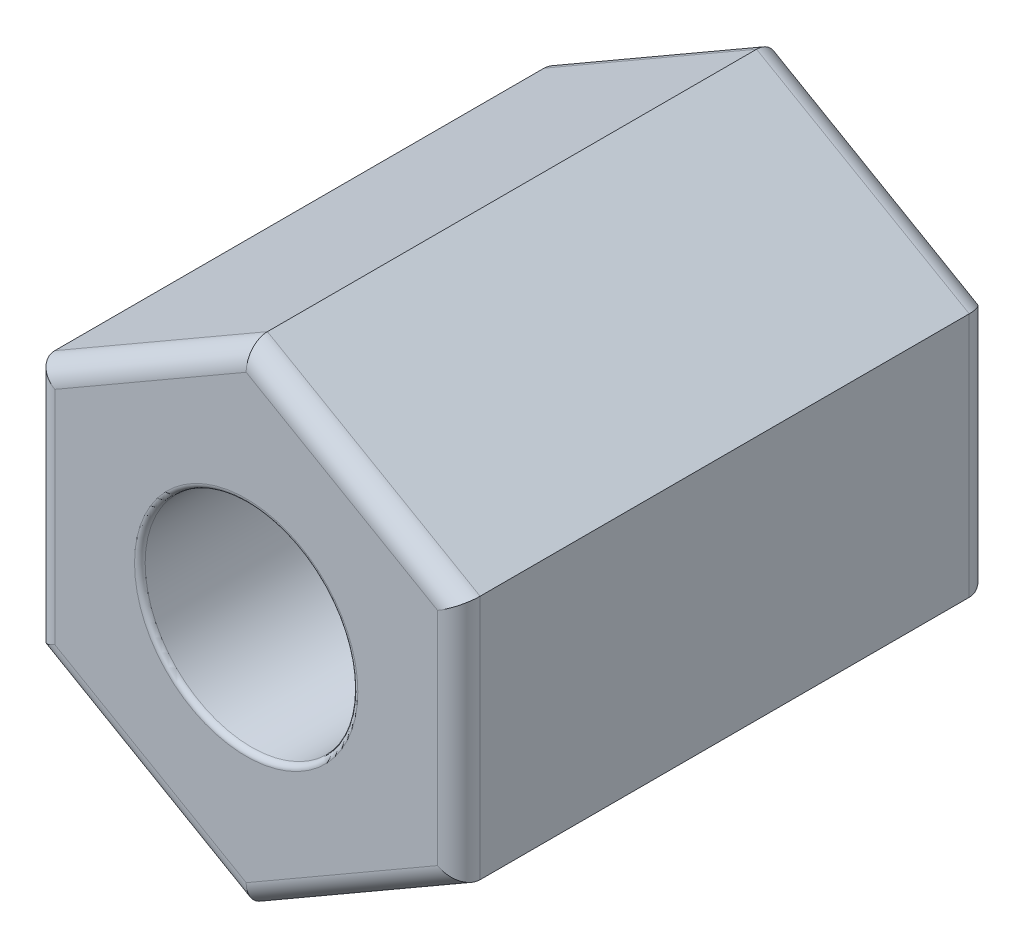
ISO-10303-21;
HEADER;
FILE_DESCRIPTION(('STEP AP214'),'2;1');
FILE_NAME('part.step','',(''),(''),'','','');
FILE_SCHEMA(('AUTOMOTIVE_DESIGN { 1 0 10303 214 1 1 1 1 }'));
ENDSEC;
DATA;
#1=APPLICATION_CONTEXT('core data for automotive mechanical design processes');
#2=APPLICATION_PROTOCOL_DEFINITION('international standard','automotive_design',2000,#1);
#3=PRODUCT_CONTEXT('',#1,'mechanical');
#4=PRODUCT('Part','Part','',(#3));
#5=PRODUCT_RELATED_PRODUCT_CATEGORY('part','',(#4));
#6=PRODUCT_DEFINITION_FORMATION('','',#4);
#7=PRODUCT_DEFINITION_CONTEXT('part definition',#1,'design');
#8=PRODUCT_DEFINITION('design','',#6,#7);
#9=PRODUCT_DEFINITION_SHAPE('','',#8);
#10=(LENGTH_UNIT() NAMED_UNIT(*) SI_UNIT(.MILLI.,.METRE.));
#11=(NAMED_UNIT(*) PLANE_ANGLE_UNIT() SI_UNIT($,.RADIAN.));
#12=(NAMED_UNIT(*) SI_UNIT($,.STERADIAN.) SOLID_ANGLE_UNIT());
#13=UNCERTAINTY_MEASURE_WITH_UNIT(LENGTH_MEASURE(1.E-05),#10,'distance_accuracy_value','');
#14=(GEOMETRIC_REPRESENTATION_CONTEXT(3) GLOBAL_UNCERTAINTY_ASSIGNED_CONTEXT((#13)) GLOBAL_UNIT_ASSIGNED_CONTEXT((#10,
#11,#12)) REPRESENTATION_CONTEXT('',''));
#15=CARTESIAN_POINT('',(0.,0.,0.));
#16=DIRECTION('',(0.,0.,1.));
#17=DIRECTION('',(1.,0.,0.));
#18=AXIS2_PLACEMENT_3D('',#15,#16,#17);
#19=CARTESIAN_POINT('',(0.,0.,50.));
#20=DIRECTION('',(0.,0.,1.));
#21=DIRECTION('',(1.,0.,0.));
#22=AXIS2_PLACEMENT_3D('',#19,#20,#21);
#23=PLANE('',#22);
#24=CARTESIAN_POINT('',(0.,0.,50.));
#25=DIRECTION('',(0.,0.,1.));
#26=DIRECTION('',(1.,0.,0.));
#27=AXIS2_PLACEMENT_3D('',#24,#25,#26);
#28=CIRCLE('',#27,10.5);
#29=CARTESIAN_POINT('',(10.5,0.,50.));
#30=VERTEX_POINT('',#29);
#31=EDGE_CURVE('E11',#30,#30,#28,.F.);
#32=ORIENTED_EDGE('',*,*,#31,.T.);
#33=EDGE_LOOP('',(#32));
#34=FACE_BOUND('',#33,.T.);
#35=DIRECTION('',(0.866025403784439,0.5,0.));
#36=VECTOR('',#35,1.);
#37=CARTESIAN_POINT('',(19.,-9.81495457622363,50.));
#38=LINE('',#37,#36);
#39=CARTESIAN_POINT('',(0.,-20.7846096908265,50.));
#40=VERTEX_POINT('',#39);
#41=CARTESIAN_POINT('',(18.,-10.3923048454133,50.));
#42=VERTEX_POINT('',#41);
#43=EDGE_CURVE('E49',#40,#42,#38,.T.);
#44=ORIENTED_EDGE('',*,*,#43,.T.);
#45=DIRECTION('',(0.,1.,0.));
#46=VECTOR('',#45,1.);
#47=CARTESIAN_POINT('',(18.,11.5470053837925,50.));
#48=LINE('',#47,#46);
#49=CARTESIAN_POINT('',(18.,10.3923048454133,50.));
#50=VERTEX_POINT('',#49);
#51=EDGE_CURVE('E129',#42,#50,#48,.T.);
#52=ORIENTED_EDGE('',*,*,#51,.T.);
#53=DIRECTION('',(-0.866025403784438,0.5,0.));
#54=VECTOR('',#53,1.);
#55=CARTESIAN_POINT('',(-0.999999999999987,21.3619599600162,50.));
#56=LINE('',#55,#54);
#57=CARTESIAN_POINT('',(0.,20.7846096908265,50.));
#58=VERTEX_POINT('',#57);
#59=EDGE_CURVE('E194',#50,#58,#56,.T.);
#60=ORIENTED_EDGE('',*,*,#59,.T.);
#61=DIRECTION('',(-0.866025403784439,-0.5,0.));
#62=VECTOR('',#61,1.);
#63=CARTESIAN_POINT('',(-19.,9.81495457622363,50.));
#64=LINE('',#63,#62);
#65=CARTESIAN_POINT('',(-18.,10.3923048454133,50.));
#66=VERTEX_POINT('',#65);
#67=EDGE_CURVE('E196',#58,#66,#64,.T.);
#68=ORIENTED_EDGE('',*,*,#67,.T.);
#69=DIRECTION('',(0.,-1.,0.));
#70=VECTOR('',#69,1.);
#71=CARTESIAN_POINT('',(-18.,-11.5470053837925,50.));
#72=LINE('',#71,#70);
#73=CARTESIAN_POINT('',(-18.,-10.3923048454133,50.));
#74=VERTEX_POINT('',#73);
#75=EDGE_CURVE('E198',#66,#74,#72,.T.);
#76=ORIENTED_EDGE('',*,*,#75,.T.);
#77=DIRECTION('',(0.866025403784439,-0.5,0.));
#78=VECTOR('',#77,1.);
#79=CARTESIAN_POINT('',(0.999999999999984,-21.3619599600162,50.));
#80=LINE('',#79,#78);
#81=EDGE_CURVE('E54',#74,#40,#80,.T.);
#82=ORIENTED_EDGE('',*,*,#81,.T.);
#83=EDGE_LOOP('',(#44,#52,#60,#68,#76,#82));
#84=FACE_BOUND('',#83,.T.);
#85=ADVANCED_FACE('F34',(#34,#84),#23,.T.);
#86=CARTESIAN_POINT('',(0.,0.,0.));
#87=DIRECTION('',(0.,0.,1.));
#88=DIRECTION('',(1.,0.,0.));
#89=AXIS2_PLACEMENT_3D('',#86,#87,#88);
#90=PLANE('',#89);
#91=CARTESIAN_POINT('',(0.,0.,0.));
#92=DIRECTION('',(0.,0.,1.));
#93=DIRECTION('',(1.,0.,0.));
#94=AXIS2_PLACEMENT_3D('',#91,#92,#93);
#95=CIRCLE('',#94,10.5);
#96=CARTESIAN_POINT('',(10.5,0.,0.));
#97=VERTEX_POINT('',#96);
#98=EDGE_CURVE('E203',#97,#97,#95,.T.);
#99=ORIENTED_EDGE('',*,*,#98,.T.);
#100=EDGE_LOOP('',(#99));
#101=FACE_BOUND('',#100,.T.);
#102=DIRECTION('',(0.,1.,0.));
#103=VECTOR('',#102,1.);
#104=CARTESIAN_POINT('',(18.,0.,0.));
#105=LINE('',#104,#103);
#106=CARTESIAN_POINT('',(18.,10.3923048454133,0.));
#107=VERTEX_POINT('',#106);
#108=CARTESIAN_POINT('',(18.,-10.3923048454133,0.));
#109=VERTEX_POINT('',#108);
#110=EDGE_CURVE('E165',#107,#109,#105,.F.);
#111=ORIENTED_EDGE('',*,*,#110,.T.);
#112=DIRECTION('',(0.866025403784439,0.5,0.));
#113=VECTOR('',#112,1.);
#114=CARTESIAN_POINT('',(9.00000000000001,-15.5884572681199,0.));
#115=LINE('',#114,#113);
#116=CARTESIAN_POINT('',(0.,-20.7846096908265,0.));
#117=VERTEX_POINT('',#116);
#118=EDGE_CURVE('E175',#109,#117,#115,.F.);
#119=ORIENTED_EDGE('',*,*,#118,.T.);
#120=DIRECTION('',(0.866025403784439,-0.5,0.));
#121=VECTOR('',#120,1.);
#122=CARTESIAN_POINT('',(-9.00000000000001,-15.5884572681199,0.));
#123=LINE('',#122,#121);
#124=CARTESIAN_POINT('',(-18.,-10.3923048454133,0.));
#125=VERTEX_POINT('',#124);
#126=EDGE_CURVE('E173',#117,#125,#123,.F.);
#127=ORIENTED_EDGE('',*,*,#126,.T.);
#128=DIRECTION('',(0.,-1.,0.));
#129=VECTOR('',#128,1.);
#130=CARTESIAN_POINT('',(-18.,0.,0.));
#131=LINE('',#130,#129);
#132=CARTESIAN_POINT('',(-18.,10.3923048454133,0.));
#133=VERTEX_POINT('',#132);
#134=EDGE_CURVE('E171',#125,#133,#131,.F.);
#135=ORIENTED_EDGE('',*,*,#134,.T.);
#136=DIRECTION('',(-0.866025403784439,-0.5,0.));
#137=VECTOR('',#136,1.);
#138=CARTESIAN_POINT('',(-9.00000000000001,15.5884572681199,0.));
#139=LINE('',#138,#137);
#140=CARTESIAN_POINT('',(0.,20.7846096908265,0.));
#141=VERTEX_POINT('',#140);
#142=EDGE_CURVE('E169',#133,#141,#139,.F.);
#143=ORIENTED_EDGE('',*,*,#142,.T.);
#144=DIRECTION('',(-0.866025403784438,0.5,0.));
#145=VECTOR('',#144,1.);
#146=CARTESIAN_POINT('',(9.00000000000001,15.5884572681199,0.));
#147=LINE('',#146,#145);
#148=EDGE_CURVE('E167',#141,#107,#147,.F.);
#149=ORIENTED_EDGE('',*,*,#148,.T.);
#150=EDGE_LOOP('',(#111,#119,#127,#135,#143,#149));
#151=FACE_BOUND('',#150,.T.);
#152=ADVANCED_FACE('F246',(#101,#151),#90,.F.);
#153=CARTESIAN_POINT('',(-20.,-11.5470053837925,50.));
#154=DIRECTION('',(0.5,0.866025403784439,0.));
#155=DIRECTION('',(-0.866025403784439,0.5,0.));
#156=AXIS2_PLACEMENT_3D('',#153,#154,#155);
#157=PLANE('',#156);
#158=DIRECTION('',(0.,0.,-1.));
#159=VECTOR('',#158,1.);
#160=CARTESIAN_POINT('',(-20.,-11.5470053837925,50.));
#161=LINE('',#160,#159);
#162=CARTESIAN_POINT('',(-20.,-11.5470053837925,48.));
#163=VERTEX_POINT('',#162);
#164=CARTESIAN_POINT('',(-20.,-11.5470053837925,2.));
#165=VERTEX_POINT('',#164);
#166=EDGE_CURVE('E221',#163,#165,#161,.T.);
#167=ORIENTED_EDGE('',*,*,#166,.T.);
#168=DIRECTION('',(0.866025403784439,-0.5,0.));
#169=VECTOR('',#168,1.);
#170=CARTESIAN_POINT('',(-20.,-11.5470053837925,2.));
#171=LINE('',#170,#169);
#172=CARTESIAN_POINT('',(0.,-23.094010767585,2.));
#173=VERTEX_POINT('',#172);
#174=EDGE_CURVE('E180',#165,#173,#171,.T.);
#175=ORIENTED_EDGE('',*,*,#174,.T.);
#176=DIRECTION('',(0.,0.,-1.));
#177=VECTOR('',#176,1.);
#178=CARTESIAN_POINT('',(0.,-23.094010767585,50.));
#179=LINE('',#178,#177);
#180=CARTESIAN_POINT('',(0.,-23.094010767585,48.));
#181=VERTEX_POINT('',#180);
#182=EDGE_CURVE('E143',#181,#173,#179,.T.);
#183=ORIENTED_EDGE('',*,*,#182,.F.);
#184=DIRECTION('',(0.866025403784439,-0.5,0.));
#185=VECTOR('',#184,1.);
#186=CARTESIAN_POINT('',(-20.,-11.5470053837925,48.));
#187=LINE('',#186,#185);
#188=EDGE_CURVE('E178',#181,#163,#187,.F.);
#189=ORIENTED_EDGE('',*,*,#188,.T.);
#190=EDGE_LOOP('',(#167,#175,#183,#189));
#191=FACE_BOUND('',#190,.T.);
#192=ADVANCED_FACE('F249',(#191),#157,.F.);
#193=CARTESIAN_POINT('',(0.,-23.094010767585,50.));
#194=DIRECTION('',(-0.5,0.866025403784438,0.));
#195=DIRECTION('',(-0.866025403784439,-0.5,0.));
#196=AXIS2_PLACEMENT_3D('',#193,#194,#195);
#197=PLANE('',#196);
#198=ORIENTED_EDGE('',*,*,#182,.T.);
#199=DIRECTION('',(0.866025403784439,0.5,0.));
#200=VECTOR('',#199,1.);
#201=CARTESIAN_POINT('',(0.,-23.094010767585,2.));
#202=LINE('',#201,#200);
#203=CARTESIAN_POINT('',(20.,-11.5470053837925,2.));
#204=VERTEX_POINT('',#203);
#205=EDGE_CURVE('E142',#173,#204,#202,.T.);
#206=ORIENTED_EDGE('',*,*,#205,.T.);
#207=DIRECTION('',(0.,0.,-1.));
#208=VECTOR('',#207,1.);
#209=CARTESIAN_POINT('',(20.,-11.5470053837925,50.));
#210=LINE('',#209,#208);
#211=CARTESIAN_POINT('',(20.,-11.5470053837925,48.));
#212=VERTEX_POINT('',#211);
#213=EDGE_CURVE('E149',#212,#204,#210,.T.);
#214=ORIENTED_EDGE('',*,*,#213,.F.);
#215=DIRECTION('',(0.866025403784439,0.5,0.));
#216=VECTOR('',#215,1.);
#217=CARTESIAN_POINT('',(0.,-23.094010767585,48.));
#218=LINE('',#217,#216);
#219=EDGE_CURVE('E135',#212,#181,#218,.F.);
#220=ORIENTED_EDGE('',*,*,#219,.T.);
#221=EDGE_LOOP('',(#198,#206,#214,#220));
#222=FACE_BOUND('',#221,.T.);
#223=ADVANCED_FACE('F156',(#222),#197,.F.);
#224=CARTESIAN_POINT('',(20.,-11.5470053837925,50.));
#225=DIRECTION('',(-1.,0.,0.));
#226=DIRECTION('',(0.,-1.,0.));
#227=AXIS2_PLACEMENT_3D('',#224,#225,#226);
#228=PLANE('',#227);
#229=ORIENTED_EDGE('',*,*,#213,.T.);
#230=DIRECTION('',(0.,1.,0.));
#231=VECTOR('',#230,1.);
#232=CARTESIAN_POINT('',(20.,-11.5470053837925,2.));
#233=LINE('',#232,#231);
#234=CARTESIAN_POINT('',(20.,11.5470053837925,2.));
#235=VERTEX_POINT('',#234);
#236=EDGE_CURVE('E152',#204,#235,#233,.T.);
#237=ORIENTED_EDGE('',*,*,#236,.T.);
#238=DIRECTION('',(0.,0.,-1.));
#239=VECTOR('',#238,1.);
#240=CARTESIAN_POINT('',(20.,11.5470053837925,50.));
#241=LINE('',#240,#239);
#242=CARTESIAN_POINT('',(20.,11.5470053837925,48.));
#243=VERTEX_POINT('',#242);
#244=EDGE_CURVE('E151',#243,#235,#241,.T.);
#245=ORIENTED_EDGE('',*,*,#244,.F.);
#246=DIRECTION('',(0.,1.,0.));
#247=VECTOR('',#246,1.);
#248=CARTESIAN_POINT('',(20.,-11.5470053837925,48.));
#249=LINE('',#248,#247);
#250=EDGE_CURVE('E127',#243,#212,#249,.F.);
#251=ORIENTED_EDGE('',*,*,#250,.T.);
#252=EDGE_LOOP('',(#229,#237,#245,#251));
#253=FACE_BOUND('',#252,.T.);
#254=ADVANCED_FACE('F148',(#253),#228,.F.);
#255=CARTESIAN_POINT('',(20.,11.5470053837925,50.));
#256=DIRECTION('',(-0.5,-0.866025403784438,0.));
#257=DIRECTION('',(0.866025403784438,-0.5,0.));
#258=AXIS2_PLACEMENT_3D('',#255,#256,#257);
#259=PLANE('',#258);
#260=ORIENTED_EDGE('',*,*,#244,.T.);
#261=DIRECTION('',(-0.866025403784438,0.5,0.));
#262=VECTOR('',#261,1.);
#263=CARTESIAN_POINT('',(20.,11.5470053837925,2.));
#264=LINE('',#263,#262);
#265=CARTESIAN_POINT('',(0.,23.0940107675851,2.));
#266=VERTEX_POINT('',#265);
#267=EDGE_CURVE('E153',#235,#266,#264,.T.);
#268=ORIENTED_EDGE('',*,*,#267,.T.);
#269=DIRECTION('',(0.,0.,-1.));
#270=VECTOR('',#269,1.);
#271=CARTESIAN_POINT('',(0.,23.0940107675851,50.));
#272=LINE('',#271,#270);
#273=CARTESIAN_POINT('',(0.,23.0940107675851,48.));
#274=VERTEX_POINT('',#273);
#275=EDGE_CURVE('E160',#274,#266,#272,.T.);
#276=ORIENTED_EDGE('',*,*,#275,.F.);
#277=DIRECTION('',(-0.866025403784438,0.5,0.));
#278=VECTOR('',#277,1.);
#279=CARTESIAN_POINT('',(20.,11.5470053837925,48.));
#280=LINE('',#279,#278);
#281=EDGE_CURVE('E190',#274,#243,#280,.F.);
#282=ORIENTED_EDGE('',*,*,#281,.T.);
#283=EDGE_LOOP('',(#260,#268,#276,#282));
#284=FACE_BOUND('',#283,.T.);
#285=ADVANCED_FACE('F265',(#284),#259,.F.);
#286=CARTESIAN_POINT('',(0.,23.0940107675851,50.));
#287=DIRECTION('',(0.5,-0.866025403784439,0.));
#288=DIRECTION('',(0.866025403784439,0.5,0.));
#289=AXIS2_PLACEMENT_3D('',#286,#287,#288);
#290=PLANE('',#289);
#291=ORIENTED_EDGE('',*,*,#275,.T.);
#292=DIRECTION('',(-0.866025403784439,-0.5,0.));
#293=VECTOR('',#292,1.);
#294=CARTESIAN_POINT('',(0.,23.0940107675851,2.));
#295=LINE('',#294,#293);
#296=CARTESIAN_POINT('',(-20.,11.5470053837925,2.));
#297=VERTEX_POINT('',#296);
#298=EDGE_CURVE('E188',#266,#297,#295,.T.);
#299=ORIENTED_EDGE('',*,*,#298,.T.);
#300=DIRECTION('',(0.,0.,-1.));
#301=VECTOR('',#300,1.);
#302=CARTESIAN_POINT('',(-20.,11.5470053837925,50.));
#303=LINE('',#302,#301);
#304=CARTESIAN_POINT('',(-20.,11.5470053837925,48.));
#305=VERTEX_POINT('',#304);
#306=EDGE_CURVE('E282',#305,#297,#303,.T.);
#307=ORIENTED_EDGE('',*,*,#306,.F.);
#308=DIRECTION('',(-0.866025403784439,-0.5,0.));
#309=VECTOR('',#308,1.);
#310=CARTESIAN_POINT('',(0.,23.0940107675851,48.));
#311=LINE('',#310,#309);
#312=EDGE_CURVE('E186',#305,#274,#311,.F.);
#313=ORIENTED_EDGE('',*,*,#312,.T.);
#314=EDGE_LOOP('',(#291,#299,#307,#313));
#315=FACE_BOUND('',#314,.T.);
#316=ADVANCED_FACE('F281',(#315),#290,.F.);
#317=CARTESIAN_POINT('',(-20.,11.5470053837925,50.));
#318=DIRECTION('',(1.,0.,0.));
#319=DIRECTION('',(0.,0.,-1.));
#320=AXIS2_PLACEMENT_3D('',#317,#318,#319);
#321=PLANE('',#320);
#322=ORIENTED_EDGE('',*,*,#306,.T.);
#323=DIRECTION('',(0.,-1.,0.));
#324=VECTOR('',#323,1.);
#325=CARTESIAN_POINT('',(-20.,11.5470053837925,2.));
#326=LINE('',#325,#324);
#327=EDGE_CURVE('E184',#297,#165,#326,.T.);
#328=ORIENTED_EDGE('',*,*,#327,.T.);
#329=ORIENTED_EDGE('',*,*,#166,.F.);
#330=DIRECTION('',(0.,-1.,0.));
#331=VECTOR('',#330,1.);
#332=CARTESIAN_POINT('',(-20.,11.5470053837925,48.));
#333=LINE('',#332,#331);
#334=EDGE_CURVE('E182',#163,#305,#333,.F.);
#335=ORIENTED_EDGE('',*,*,#334,.T.);
#336=EDGE_LOOP('',(#322,#328,#329,#335));
#337=FACE_BOUND('',#336,.T.);
#338=ADVANCED_FACE('F285',(#337),#321,.F.);
#339=CARTESIAN_POINT('',(0.,0.,50.));
#340=DIRECTION('',(0.,0.,-1.));
#341=DIRECTION('',(-1.,0.,0.));
#342=AXIS2_PLACEMENT_3D('',#339,#340,#341);
#343=CYLINDRICAL_SURFACE('',#342,10.);
#344=CARTESIAN_POINT('',(0.,0.,0.5));
#345=DIRECTION('',(0.,0.,1.));
#346=DIRECTION('',(1.,0.,0.));
#347=AXIS2_PLACEMENT_3D('',#344,#345,#346);
#348=CIRCLE('',#347,10.);
#349=CARTESIAN_POINT('',(10.,0.,0.5));
#350=VERTEX_POINT('',#349);
#351=EDGE_CURVE('E42',#350,#350,#348,.F.);
#352=ORIENTED_EDGE('',*,*,#351,.T.);
#353=EDGE_LOOP('',(#352));
#354=FACE_BOUND('',#353,.T.);
#355=CARTESIAN_POINT('',(0.,0.,49.5));
#356=DIRECTION('',(0.,0.,1.));
#357=DIRECTION('',(1.,0.,0.));
#358=AXIS2_PLACEMENT_3D('',#355,#356,#357);
#359=CIRCLE('',#358,10.);
#360=CARTESIAN_POINT('',(10.,0.,49.5));
#361=VERTEX_POINT('',#360);
#362=EDGE_CURVE('E233',#361,#361,#359,.T.);
#363=ORIENTED_EDGE('',*,*,#362,.T.);
#364=EDGE_LOOP('',(#363));
#365=FACE_BOUND('',#364,.T.);
#366=ADVANCED_FACE('F238',(#354,#365),#343,.F.);
#367=CARTESIAN_POINT('',(1.00000000000001,21.3619599600162,2.));
#368=DIRECTION('',(-0.866025403784439,-0.5,0.));
#369=DIRECTION('',(0.5,-0.866025403784439,0.));
#370=AXIS2_PLACEMENT_3D('',#367,#368,#369);
#371=CYLINDRICAL_SURFACE('',#370,2.);
#372=CARTESIAN_POINT('',(0.,20.7846096908265,2.));
#373=DIRECTION('',(-1.,0.,0.));
#374=DIRECTION('',(0.,1.,0.));
#375=AXIS2_PLACEMENT_3D('',#372,#373,#374);
#376=ELLIPSE('',#375,2.3094010767585,2.);
#377=EDGE_CURVE('E215',#141,#266,#376,.F.);
#378=ORIENTED_EDGE('',*,*,#377,.F.);
#379=ORIENTED_EDGE('',*,*,#142,.F.);
#380=CARTESIAN_POINT('',(-18.,10.3923048454133,2.));
#381=DIRECTION('',(-0.5,-0.866025403784439,0.));
#382=DIRECTION('',(-0.866025403784439,0.5,0.));
#383=AXIS2_PLACEMENT_3D('',#380,#381,#382);
#384=ELLIPSE('',#383,2.3094010767585,2.);
#385=EDGE_CURVE('E218',#297,#133,#384,.T.);
#386=ORIENTED_EDGE('',*,*,#385,.F.);
#387=ORIENTED_EDGE('',*,*,#298,.F.);
#388=EDGE_LOOP('',(#378,#379,#386,#387));
#389=FACE_BOUND('',#388,.T.);
#390=ADVANCED_FACE('F275',(#389),#371,.T.);
#391=CARTESIAN_POINT('',(-18.,11.5470053837925,2.));
#392=DIRECTION('',(0.,-1.,0.));
#393=DIRECTION('',(0.,0.,-1.));
#394=AXIS2_PLACEMENT_3D('',#391,#392,#393);
#395=CYLINDRICAL_SURFACE('',#394,2.);
#396=ORIENTED_EDGE('',*,*,#385,.T.);
#397=ORIENTED_EDGE('',*,*,#134,.F.);
#398=CARTESIAN_POINT('',(-18.,-10.3923048454133,2.));
#399=DIRECTION('',(0.5,-0.866025403784439,0.));
#400=DIRECTION('',(-0.866025403784439,-0.5,0.));
#401=AXIS2_PLACEMENT_3D('',#398,#399,#400);
#402=ELLIPSE('',#401,2.3094010767585,2.);
#403=EDGE_CURVE('E212',#165,#125,#402,.T.);
#404=ORIENTED_EDGE('',*,*,#403,.F.);
#405=ORIENTED_EDGE('',*,*,#327,.F.);
#406=EDGE_LOOP('',(#396,#397,#404,#405));
#407=FACE_BOUND('',#406,.T.);
#408=ADVANCED_FACE('F297',(#407),#395,.T.);
#409=CARTESIAN_POINT('',(19.,9.81495457622366,2.));
#410=DIRECTION('',(-0.866025403784438,0.5,0.));
#411=DIRECTION('',(-0.5,-0.866025403784438,0.));
#412=AXIS2_PLACEMENT_3D('',#409,#410,#411);
#413=CYLINDRICAL_SURFACE('',#412,2.);
#414=ORIENTED_EDGE('',*,*,#377,.T.);
#415=ORIENTED_EDGE('',*,*,#267,.F.);
#416=CARTESIAN_POINT('',(18.,10.3923048454133,2.));
#417=DIRECTION('',(-0.5,0.866025403784439,0.));
#418=DIRECTION('',(0.866025403784439,0.5,0.));
#419=AXIS2_PLACEMENT_3D('',#416,#417,#418);
#420=ELLIPSE('',#419,2.3094010767585,2.);
#421=EDGE_CURVE('E209',#107,#235,#420,.F.);
#422=ORIENTED_EDGE('',*,*,#421,.F.);
#423=ORIENTED_EDGE('',*,*,#148,.F.);
#424=EDGE_LOOP('',(#414,#415,#422,#423));
#425=FACE_BOUND('',#424,.T.);
#426=ADVANCED_FACE('F270',(#425),#413,.T.);
#427=CARTESIAN_POINT('',(-19.,-9.81495457622364,2.));
#428=DIRECTION('',(0.866025403784439,-0.5,0.));
#429=DIRECTION('',(0.5,0.866025403784439,0.));
#430=AXIS2_PLACEMENT_3D('',#427,#428,#429);
#431=CYLINDRICAL_SURFACE('',#430,2.);
#432=ORIENTED_EDGE('',*,*,#403,.T.);
#433=ORIENTED_EDGE('',*,*,#126,.F.);
#434=CARTESIAN_POINT('',(0.,-20.7846096908265,2.));
#435=DIRECTION('',(1.,0.,0.));
#436=DIRECTION('',(0.,-1.,0.));
#437=AXIS2_PLACEMENT_3D('',#434,#435,#436);
#438=ELLIPSE('',#437,2.3094010767585,2.);
#439=EDGE_CURVE('E206',#173,#117,#438,.T.);
#440=ORIENTED_EDGE('',*,*,#439,.F.);
#441=ORIENTED_EDGE('',*,*,#174,.F.);
#442=EDGE_LOOP('',(#432,#433,#440,#441));
#443=FACE_BOUND('',#442,.T.);
#444=ADVANCED_FACE('F299',(#443),#431,.T.);
#445=CARTESIAN_POINT('',(18.,-11.5470053837925,2.));
#446=DIRECTION('',(0.,1.,0.));
#447=DIRECTION('',(-1.,0.,0.));
#448=AXIS2_PLACEMENT_3D('',#445,#446,#447);
#449=CYLINDRICAL_SURFACE('',#448,2.);
#450=ORIENTED_EDGE('',*,*,#421,.T.);
#451=ORIENTED_EDGE('',*,*,#236,.F.);
#452=CARTESIAN_POINT('',(18.,-10.3923048454133,2.));
#453=DIRECTION('',(0.5,0.866025403784439,0.));
#454=DIRECTION('',(-0.866025403784439,0.5,0.));
#455=AXIS2_PLACEMENT_3D('',#452,#453,#454);
#456=ELLIPSE('',#455,2.3094010767585,2.);
#457=EDGE_CURVE('E204',#109,#204,#456,.F.);
#458=ORIENTED_EDGE('',*,*,#457,.F.);
#459=ORIENTED_EDGE('',*,*,#110,.F.);
#460=EDGE_LOOP('',(#450,#451,#458,#459));
#461=FACE_BOUND('',#460,.T.);
#462=ADVANCED_FACE('F262',(#461),#449,.T.);
#463=CARTESIAN_POINT('',(-1.00000000000002,-21.3619599600162,2.));
#464=DIRECTION('',(0.866025403784439,0.5,0.));
#465=DIRECTION('',(-0.5,0.866025403784438,0.));
#466=AXIS2_PLACEMENT_3D('',#463,#464,#465);
#467=CYLINDRICAL_SURFACE('',#466,2.);
#468=ORIENTED_EDGE('',*,*,#439,.T.);
#469=ORIENTED_EDGE('',*,*,#118,.F.);
#470=ORIENTED_EDGE('',*,*,#457,.T.);
#471=ORIENTED_EDGE('',*,*,#205,.F.);
#472=EDGE_LOOP('',(#468,#469,#470,#471));
#473=FACE_BOUND('',#472,.T.);
#474=ADVANCED_FACE('F258',(#473),#467,.T.);
#475=CARTESIAN_POINT('',(-18.,0.,48.));
#476=DIRECTION('',(0.,1.,0.));
#477=DIRECTION('',(0.,0.,1.));
#478=AXIS2_PLACEMENT_3D('',#475,#476,#477);
#479=CYLINDRICAL_SURFACE('',#478,2.);
#480=CARTESIAN_POINT('',(-18.,10.3923048454133,48.));
#481=DIRECTION('',(0.5,0.866025403784439,0.));
#482=DIRECTION('',(0.866025403784439,-0.5,0.));
#483=AXIS2_PLACEMENT_3D('',#480,#481,#482);
#484=ELLIPSE('',#483,2.3094010767585,2.);
#485=EDGE_CURVE('E226',#305,#66,#484,.T.);
#486=ORIENTED_EDGE('',*,*,#485,.F.);
#487=ORIENTED_EDGE('',*,*,#334,.F.);
#488=CARTESIAN_POINT('',(-18.,-10.3923048454133,48.));
#489=DIRECTION('',(-0.5,0.866025403784439,0.));
#490=DIRECTION('',(0.866025403784439,0.5,0.));
#491=AXIS2_PLACEMENT_3D('',#488,#489,#490);
#492=ELLIPSE('',#491,2.3094010767585,2.);
#493=EDGE_CURVE('E207',#74,#163,#492,.F.);
#494=ORIENTED_EDGE('',*,*,#493,.F.);
#495=ORIENTED_EDGE('',*,*,#75,.F.);
#496=EDGE_LOOP('',(#486,#487,#494,#495));
#497=FACE_BOUND('',#496,.T.);
#498=ADVANCED_FACE('F328',(#497),#479,.T.);
#499=CARTESIAN_POINT('',(-9.00000000000001,-15.5884572681199,48.));
#500=DIRECTION('',(-0.866025403784439,0.5,0.));
#501=DIRECTION('',(-0.5,-0.866025403784439,0.));
#502=AXIS2_PLACEMENT_3D('',#499,#500,#501);
#503=CYLINDRICAL_SURFACE('',#502,2.);
#504=ORIENTED_EDGE('',*,*,#493,.T.);
#505=ORIENTED_EDGE('',*,*,#188,.F.);
#506=CARTESIAN_POINT('',(0.,-20.7846096908265,48.));
#507=DIRECTION('',(-1.,0.,0.));
#508=DIRECTION('',(0.,1.,0.));
#509=AXIS2_PLACEMENT_3D('',#506,#507,#508);
#510=ELLIPSE('',#509,2.3094010767585,2.);
#511=EDGE_CURVE('E137',#40,#181,#510,.F.);
#512=ORIENTED_EDGE('',*,*,#511,.F.);
#513=ORIENTED_EDGE('',*,*,#81,.F.);
#514=EDGE_LOOP('',(#504,#505,#512,#513));
#515=FACE_BOUND('',#514,.T.);
#516=ADVANCED_FACE('F332',(#515),#503,.T.);
#517=CARTESIAN_POINT('',(-9.00000000000001,15.5884572681199,48.));
#518=DIRECTION('',(0.866025403784439,0.5,0.));
#519=DIRECTION('',(-0.5,0.866025403784439,0.));
#520=AXIS2_PLACEMENT_3D('',#517,#518,#519);
#521=CYLINDRICAL_SURFACE('',#520,2.);
#522=ORIENTED_EDGE('',*,*,#485,.T.);
#523=ORIENTED_EDGE('',*,*,#67,.F.);
#524=CARTESIAN_POINT('',(0.,20.7846096908265,48.));
#525=DIRECTION('',(1.,0.,0.));
#526=DIRECTION('',(0.,-1.,0.));
#527=AXIS2_PLACEMENT_3D('',#524,#525,#526);
#528=ELLIPSE('',#527,2.3094010767585,2.);
#529=EDGE_CURVE('E131',#274,#58,#528,.T.);
#530=ORIENTED_EDGE('',*,*,#529,.F.);
#531=ORIENTED_EDGE('',*,*,#312,.F.);
#532=EDGE_LOOP('',(#522,#523,#530,#531));
#533=FACE_BOUND('',#532,.T.);
#534=ADVANCED_FACE('F338',(#533),#521,.T.);
#535=CARTESIAN_POINT('',(9.00000000000001,-15.5884572681199,48.));
#536=DIRECTION('',(-0.866025403784439,-0.5,0.));
#537=DIRECTION('',(0.5,-0.866025403784438,0.));
#538=AXIS2_PLACEMENT_3D('',#535,#536,#537);
#539=CYLINDRICAL_SURFACE('',#538,2.);
#540=ORIENTED_EDGE('',*,*,#511,.T.);
#541=ORIENTED_EDGE('',*,*,#219,.F.);
#542=CARTESIAN_POINT('',(18.,-10.3923048454133,48.));
#543=DIRECTION('',(-0.5,-0.866025403784439,0.));
#544=DIRECTION('',(-0.866025403784439,0.5,0.));
#545=AXIS2_PLACEMENT_3D('',#542,#543,#544);
#546=ELLIPSE('',#545,2.3094010767585,2.);
#547=EDGE_CURVE('E123',#42,#212,#546,.F.);
#548=ORIENTED_EDGE('',*,*,#547,.F.);
#549=ORIENTED_EDGE('',*,*,#43,.F.);
#550=EDGE_LOOP('',(#540,#541,#548,#549));
#551=FACE_BOUND('',#550,.T.);
#552=ADVANCED_FACE('F136',(#551),#539,.T.);
#553=CARTESIAN_POINT('',(9.00000000000001,15.5884572681199,48.));
#554=DIRECTION('',(0.866025403784438,-0.5,0.));
#555=DIRECTION('',(0.5,0.866025403784438,0.));
#556=AXIS2_PLACEMENT_3D('',#553,#554,#555);
#557=CYLINDRICAL_SURFACE('',#556,2.);
#558=ORIENTED_EDGE('',*,*,#529,.T.);
#559=ORIENTED_EDGE('',*,*,#59,.F.);
#560=CARTESIAN_POINT('',(18.,10.3923048454133,48.));
#561=DIRECTION('',(0.5,-0.866025403784439,0.));
#562=DIRECTION('',(0.866025403784439,0.5,0.));
#563=AXIS2_PLACEMENT_3D('',#560,#561,#562);
#564=ELLIPSE('',#563,2.3094010767585,2.);
#565=EDGE_CURVE('E132',#243,#50,#564,.T.);
#566=ORIENTED_EDGE('',*,*,#565,.F.);
#567=ORIENTED_EDGE('',*,*,#281,.F.);
#568=EDGE_LOOP('',(#558,#559,#566,#567));
#569=FACE_BOUND('',#568,.T.);
#570=ADVANCED_FACE('F347',(#569),#557,.T.);
#571=CARTESIAN_POINT('',(18.,0.,48.));
#572=DIRECTION('',(0.,-1.,0.));
#573=DIRECTION('',(1.,0.,0.));
#574=AXIS2_PLACEMENT_3D('',#571,#572,#573);
#575=CYLINDRICAL_SURFACE('',#574,2.);
#576=ORIENTED_EDGE('',*,*,#547,.T.);
#577=ORIENTED_EDGE('',*,*,#250,.F.);
#578=ORIENTED_EDGE('',*,*,#565,.T.);
#579=ORIENTED_EDGE('',*,*,#51,.F.);
#580=EDGE_LOOP('',(#576,#577,#578,#579));
#581=FACE_BOUND('',#580,.T.);
#582=ADVANCED_FACE('F125',(#581),#575,.T.);
#583=CARTESIAN_POINT('',(0.,0.,0.5));
#584=DIRECTION('',(0.,0.,1.));
#585=DIRECTION('',(1.,0.,0.));
#586=AXIS2_PLACEMENT_3D('',#583,#584,#585);
#587=TOROIDAL_SURFACE('',#586,10.5,0.5);
#588=ORIENTED_EDGE('',*,*,#351,.F.);
#589=EDGE_LOOP('',(#588));
#590=FACE_BOUND('',#589,.T.);
#591=ORIENTED_EDGE('',*,*,#98,.F.);
#592=EDGE_LOOP('',(#591));
#593=FACE_BOUND('',#592,.T.);
#594=ADVANCED_FACE('F241',(#590,#593),#587,.T.);
#595=CARTESIAN_POINT('',(0.,0.,49.5));
#596=DIRECTION('',(0.,0.,1.));
#597=DIRECTION('',(1.,0.,0.));
#598=AXIS2_PLACEMENT_3D('',#595,#596,#597);
#599=TOROIDAL_SURFACE('',#598,10.5,0.5);
#600=ORIENTED_EDGE('',*,*,#31,.F.);
#601=EDGE_LOOP('',(#600));
#602=FACE_BOUND('',#601,.T.);
#603=ORIENTED_EDGE('',*,*,#362,.F.);
#604=EDGE_LOOP('',(#603));
#605=FACE_BOUND('',#604,.T.);
#606=ADVANCED_FACE('F36',(#602,#605),#599,.T.);
#607=CLOSED_SHELL('',(#85,#152,#192,#223,#254,#285,#316,#338,#366,#390,#408,#426,#444,#462,#474,
#498,#516,#534,#552,#570,#582,#594,#606));
#608=MANIFOLD_SOLID_BREP('B2',#607);
#609=ADVANCED_BREP_SHAPE_REPRESENTATION('',(#18,#608),#14);
#610=SHAPE_DEFINITION_REPRESENTATION(#9,#609);
ENDSEC;
END-ISO-10303-21;
